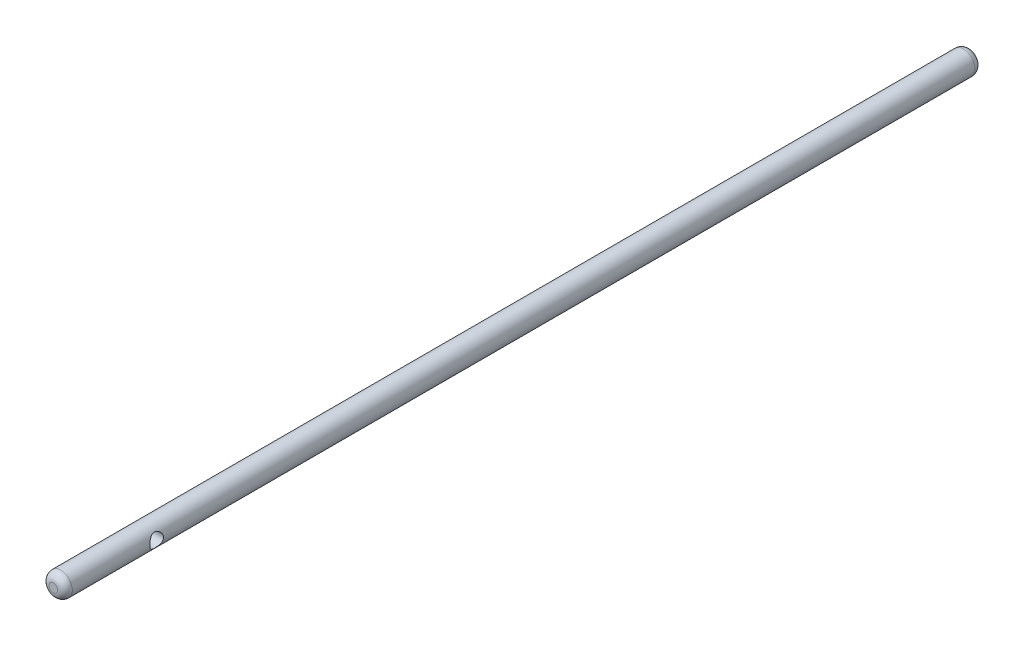
ISO-10303-21;
HEADER;
FILE_DESCRIPTION(('STEP AP214'),'2;1');
FILE_NAME('part.step','',(''),(''),'','','');
FILE_SCHEMA(('AUTOMOTIVE_DESIGN { 1 0 10303 214 1 1 1 1 }'));
ENDSEC;
DATA;
#1=APPLICATION_CONTEXT('core data for automotive mechanical design processes');
#2=APPLICATION_PROTOCOL_DEFINITION('international standard','automotive_design',2000,#1);
#3=PRODUCT_CONTEXT('',#1,'mechanical');
#4=PRODUCT('Part','Part','',(#3));
#5=PRODUCT_RELATED_PRODUCT_CATEGORY('part','',(#4));
#6=PRODUCT_DEFINITION_FORMATION('','',#4);
#7=PRODUCT_DEFINITION_CONTEXT('part definition',#1,'design');
#8=PRODUCT_DEFINITION('design','',#6,#7);
#9=PRODUCT_DEFINITION_SHAPE('','',#8);
#10=(LENGTH_UNIT() NAMED_UNIT(*) SI_UNIT(.MILLI.,.METRE.));
#11=(NAMED_UNIT(*) PLANE_ANGLE_UNIT() SI_UNIT($,.RADIAN.));
#12=(NAMED_UNIT(*) SI_UNIT($,.STERADIAN.) SOLID_ANGLE_UNIT());
#13=UNCERTAINTY_MEASURE_WITH_UNIT(LENGTH_MEASURE(1.E-05),#10,'distance_accuracy_value','');
#14=(GEOMETRIC_REPRESENTATION_CONTEXT(3) GLOBAL_UNCERTAINTY_ASSIGNED_CONTEXT((#13)) GLOBAL_UNIT_ASSIGNED_CONTEXT((#10,
#11,#12)) REPRESENTATION_CONTEXT('',''));
#15=CARTESIAN_POINT('',(0.,0.,0.));
#16=DIRECTION('',(0.,0.,1.));
#17=DIRECTION('',(1.,0.,0.));
#18=AXIS2_PLACEMENT_3D('',#15,#16,#17);
#19=CARTESIAN_POINT('',(0.,0.,-500.));
#20=DIRECTION('',(0.,0.,1.));
#21=DIRECTION('',(1.,0.,0.));
#22=AXIS2_PLACEMENT_3D('',#19,#20,#21);
#23=CYLINDRICAL_SURFACE('',#22,12.7);
#24=CARTESIAN_POINT('',(-12.6984250992003,0.199999999999999,407.5));
#25=CARTESIAN_POINT('',(-12.7014408806415,0.00843245733583666,407.499998475668));
#26=CARTESIAN_POINT('',(-12.7001142386903,-0.18326229050045,407.492648675079));
#27=CARTESIAN_POINT('',(-12.6888512329599,-0.565357987226296,407.46330905064));
#28=CARTESIAN_POINT('',(-12.6789095353173,-0.755758060923144,407.44131015901));
#29=CARTESIAN_POINT('',(-12.6506869813765,-1.13409392210284,407.382878791407));
#30=CARTESIAN_POINT('',(-12.6323896034887,-1.32202406483581,407.346417738429));
#31=CARTESIAN_POINT('',(-12.5879427007201,-1.69374092576526,407.25949029705));
#32=CARTESIAN_POINT('',(-12.5617898417468,-1.87752584893226,407.209017962549));
#33=CARTESIAN_POINT('',(-12.5024574274268,-2.23872362154391,407.094949727216));
#34=CARTESIAN_POINT('',(-12.4693150712888,-2.41616460762547,407.031423346212));
#35=CARTESIAN_POINT('',(-12.3966951095457,-2.7647173345326,406.891714114803));
#36=CARTESIAN_POINT('',(-12.3572150566043,-2.93582659879274,406.815526374744));
#37=CARTESIAN_POINT('',(-12.2728345273605,-3.27067463208774,406.651252806389));
#38=CARTESIAN_POINT('',(-12.2279381160267,-3.43441880345782,406.563175895068));
#39=CARTESIAN_POINT('',(-12.133643503418,-3.75399834042981,406.375754712707));
#40=CARTESIAN_POINT('',(-12.0842436420517,-3.90983075632296,406.276406283358));
#41=CARTESIAN_POINT('',(-11.9235310811938,-4.38593825731305,405.947654086718));
#42=CARTESIAN_POINT('',(-11.8058448920304,-4.6911315136987,405.69911392941));
#43=CARTESIAN_POINT('',(-11.5644700925307,-5.25815881251966,405.158703083844));
#44=CARTESIAN_POINT('',(-11.4407745884492,-5.51994146049535,404.866781800112));
#45=CARTESIAN_POINT('',(-11.2522374683788,-5.89062252097297,404.382025957762));
#46=CARTESIAN_POINT('',(-11.1855127038645,-6.01600785019944,404.202314542965));
#47=CARTESIAN_POINT('',(-11.0558167124279,-6.251154241863,403.831551558061));
#48=CARTESIAN_POINT('',(-10.9928460368361,-6.36091301263241,403.640498330462));
#49=CARTESIAN_POINT('',(-10.8729665563904,-6.56372391533479,403.248191733481));
#50=CARTESIAN_POINT('',(-10.8160509497455,-6.65679487538307,403.046950192208));
#51=CARTESIAN_POINT('',(-10.7104917980244,-6.82533987117187,402.635156362853));
#52=CARTESIAN_POINT('',(-10.6618456100311,-6.90081953198694,402.424607076748));
#53=CARTESIAN_POINT('',(-10.5845002165463,-7.01870227784268,402.042346598529));
#54=CARTESIAN_POINT('',(-10.5537640217388,-7.06472889802692,401.872157513883));
#55=CARTESIAN_POINT('',(-10.499685472649,-7.14485464262336,401.527852600083));
#56=CARTESIAN_POINT('',(-10.476341629625,-7.17895616876805,401.353737569149));
#57=CARTESIAN_POINT('',(-10.4378700783978,-7.23477855282613,401.002798793531));
#58=CARTESIAN_POINT('',(-10.4227346361699,-7.25651106588678,400.825977760585));
#59=CARTESIAN_POINT('',(-10.4012046251758,-7.28733827499528,400.470697556117));
#60=CARTESIAN_POINT('',(-10.3948102042321,-7.29643275731717,400.292238356943));
#61=CARTESIAN_POINT('',(-10.3910055963949,-7.30185006995639,399.934724909439));
#62=CARTESIAN_POINT('',(-10.3936107272691,-7.29815112509373,399.755670165309));
#63=CARTESIAN_POINT('',(-10.4077379283561,-7.27799013783562,399.398639068029));
#64=CARTESIAN_POINT('',(-10.4192600382618,-7.26152803862632,399.220662719682));
#65=CARTESIAN_POINT('',(-10.4507915107074,-7.21607357006515,398.867016601017));
#66=CARTESIAN_POINT('',(-10.4708042377926,-7.18707623333507,398.691347773571));
#67=CARTESIAN_POINT('',(-10.5186096451898,-7.11692687276256,398.343472187031));
#68=CARTESIAN_POINT('',(-10.5464054799055,-7.07576992039479,398.171266862048));
#69=CARTESIAN_POINT('',(-10.6085230470658,-6.98228824898791,397.833165907502));
#70=CARTESIAN_POINT('',(-10.6427720998919,-6.93008717901108,397.667222601945));
#71=CARTESIAN_POINT('',(-10.7169814153346,-6.81476384851618,397.340464364831));
#72=CARTESIAN_POINT('',(-10.756943547512,-6.75163801152342,397.179651133205));
#73=CARTESIAN_POINT('',(-10.8838031984132,-6.54665324427669,396.705910588698));
#74=CARTESIAN_POINT('',(-10.9777065650814,-6.38914011402646,396.401514901478));
#75=CARTESIAN_POINT('',(-11.1916958010933,-6.0075774324514,395.772436107813));
#76=CARTESIAN_POINT('',(-11.3135630262078,-5.77689857912188,395.452376161977));
#77=CARTESIAN_POINT('',(-11.4975357044339,-5.39598799077041,395.002640301117));
#78=CARTESIAN_POINT('',(-11.5591019039025,-5.26308948805013,394.857689954567));
#79=CARTESIAN_POINT('',(-11.6812785861729,-4.98604289804121,394.578410224891));
#80=CARTESIAN_POINT('',(-11.7418889025849,-4.8418928776305,394.444082674882));
#81=CARTESIAN_POINT('',(-11.8678013255451,-4.52522457456646,394.171543778134));
#82=CARTESIAN_POINT('',(-11.9328112588691,-4.35136708321929,394.03474991998));
#83=CARTESIAN_POINT('',(-12.0580652490799,-3.99116516979889,393.776397393245));
#84=CARTESIAN_POINT('',(-12.1183112407378,-3.80482587432357,393.654832527897));
#85=CARTESIAN_POINT('',(-12.2323137029125,-3.42061977713192,393.428024652177));
#86=CARTESIAN_POINT('',(-12.286071633771,-3.2227555843764,393.322777967363));
#87=CARTESIAN_POINT('',(-12.3854659196524,-2.81671746843187,393.129779956478));
#88=CARTESIAN_POINT('',(-12.4311033180087,-2.60854487407533,393.042026382702));
#89=CARTESIAN_POINT('',(-12.5098843682192,-2.19846729485912,392.890732244151));
#90=CARTESIAN_POINT('',(-12.5436826802771,-1.99715771039033,392.82591948993));
#91=CARTESIAN_POINT('',(-12.60195327381,-1.58850714648028,392.713289534136));
#92=CARTESIAN_POINT('',(-12.6264259033909,-1.38116639247954,392.665471698186));
#93=CARTESIAN_POINT('',(-12.6652246673758,-0.96242304263274,392.587572105872));
#94=CARTESIAN_POINT('',(-12.6795595326386,-0.751024103366659,392.55747509171));
#95=CARTESIAN_POINT('',(-12.6975964690562,-0.325987164099469,392.515420777907));
#96=CARTESIAN_POINT('',(-12.7012997861027,-0.112349429403914,392.503461352832));
#97=CARTESIAN_POINT('',(-12.6981052703946,0.288230428514965,392.498189249279));
#98=CARTESIAN_POINT('',(-12.6924792523771,0.475158842161556,392.502725255581));
#99=CARTESIAN_POINT('',(-12.6730477100264,0.84773265751428,392.52569262094));
#100=CARTESIAN_POINT('',(-12.6592423303762,1.03337808185617,392.544123734211));
#101=CARTESIAN_POINT('',(-12.6237324144718,1.40202497684361,392.59461338564));
#102=CARTESIAN_POINT('',(-12.6020281842127,1.58502654962432,392.626671395911));
#103=CARTESIAN_POINT('',(-12.551175709663,1.94715887496309,392.703992747738));
#104=CARTESIAN_POINT('',(-12.5220272312363,2.12628950558028,392.749256504647));
#105=CARTESIAN_POINT('',(-12.4572314694887,2.47769123223032,392.851905001765));
#106=CARTESIAN_POINT('',(-12.4216570268015,2.6500152022577,392.9091549273));
#107=CARTESIAN_POINT('',(-12.3444994829221,2.98891127097746,393.035467118587));
#108=CARTESIAN_POINT('',(-12.3029144012085,3.15548145127887,393.104533279204));
#109=CARTESIAN_POINT('',(-12.1702943635033,3.64527963738889,393.328511153114));
#110=CARTESIAN_POINT('',(-12.0713469802098,3.95884469753889,393.500276111835));
#111=CARTESIAN_POINT('',(-11.8475847824787,4.58784873017469,393.904765744695));
#112=CARTESIAN_POINT('',(-11.7211209995711,4.89968628536997,394.142122250626));
#113=CARTESIAN_POINT('',(-11.460545148463,5.48156385528155,394.660795732797));
#114=CARTESIAN_POINT('',(-11.3264236352952,5.75155065830454,394.942167775066));
#115=CARTESIAN_POINT('',(-11.1196685839662,6.13742386202432,395.412507417316));
#116=CARTESIAN_POINT('',(-11.045753680156,6.26912852100599,395.588189016651));
#117=CARTESIAN_POINT('',(-10.901200349098,6.51723956493896,395.951439500261));
#118=CARTESIAN_POINT('',(-10.8305624730036,6.63364338248019,396.139010371693));
#119=CARTESIAN_POINT('',(-10.6949835146619,6.85008273147863,396.525043131302));
#120=CARTESIAN_POINT('',(-10.6300363657176,6.95013579488697,396.723493045424));
#121=CARTESIAN_POINT('',(-10.5082284772461,7.13296611598895,397.130555268636));
#122=CARTESIAN_POINT('',(-10.4513648348716,7.21574958034169,397.339163893345));
#123=CARTESIAN_POINT('',(-10.3603481688753,7.34560496278158,397.715248965298));
#124=CARTESIAN_POINT('',(-10.3239976363185,7.39649801930598,397.880882542627));
#125=CARTESIAN_POINT('',(-10.2586000708784,7.48693813041222,398.216544290421));
#126=CARTESIAN_POINT('',(-10.229548517189,7.52649221022586,398.38656966838));
#127=CARTESIAN_POINT('',(-10.1797153568396,7.59375739456248,398.729985932409));
#128=CARTESIAN_POINT('',(-10.1589261073829,7.62147944571194,398.903373551863));
#129=CARTESIAN_POINT('',(-10.12633417824,7.66473052125041,399.252513431133));
#130=CARTESIAN_POINT('',(-10.1145315933228,7.68025941705646,399.428265715867));
#131=CARTESIAN_POINT('',(-10.1003472366476,7.69890421132233,399.781381637833));
#132=CARTESIAN_POINT('',(-10.0979959747138,7.70197990983658,399.958748643994));
#133=CARTESIAN_POINT('',(-10.1028922217025,7.69555612971411,400.31312033619));
#134=CARTESIAN_POINT('',(-10.1101397579513,7.68605661527755,400.490125021193));
#135=CARTESIAN_POINT('',(-10.1339531719106,7.6546311607996,400.842484745533));
#136=CARTESIAN_POINT('',(-10.1505241727639,7.63269838876759,401.017838823973));
#137=CARTESIAN_POINT('',(-10.1923603016095,7.57674115608867,401.365541206039));
#138=CARTESIAN_POINT('',(-10.217625528874,7.54271655737498,401.53788947532));
#139=CARTESIAN_POINT('',(-10.2748848629583,7.4645157547344,401.87221401799));
#140=CARTESIAN_POINT('',(-10.3065956467105,7.42076139571833,402.034338175023));
#141=CARTESIAN_POINT('',(-10.3763262009409,7.32294044079929,402.35408040555));
#142=CARTESIAN_POINT('',(-10.4143481065943,7.26887035395724,402.511696932797));
#143=CARTESIAN_POINT('',(-10.5363645016003,7.09193719819432,402.976771586098));
#144=CARTESIAN_POINT('',(-10.6283403024419,6.95431115569881,403.276623320934));
#145=CARTESIAN_POINT('',(-10.8415901177579,6.61782731652623,403.899564265047));
#146=CARTESIAN_POINT('',(-10.9651955306718,6.41263433728091,404.218423947271));
#147=CARTESIAN_POINT('',(-11.1551857534009,6.07197253507479,404.669638524751));
#148=CARTESIAN_POINT('',(-11.2193258384075,5.95284531842358,404.815623221899));
#149=CARTESIAN_POINT('',(-11.3478780489717,5.70396851292122,405.098212683704));
#150=CARTESIAN_POINT('',(-11.4122902167997,5.57421721128974,405.234815929362));
#151=CARTESIAN_POINT('',(-11.550551591037,5.28250838448752,405.519617531724));
#152=CARTESIAN_POINT('',(-11.6242234353978,5.11875231183112,405.666064428153));
#153=CARTESIAN_POINT('',(-11.7683011589476,4.77820646892204,405.944610570529));
#154=CARTESIAN_POINT('',(-11.8387080434993,4.60142075482622,406.076714250146));
#155=CARTESIAN_POINT('',(-11.9745340285013,4.23540571361715,406.325703222225));
#156=CARTESIAN_POINT('',(-12.0399494802987,4.04616746857862,406.442577425539));
#157=CARTESIAN_POINT('',(-12.1640023393268,3.65634616771156,406.65983817601));
#158=CARTESIAN_POINT('',(-12.2226406471301,3.45576462451134,406.760226914566));
#159=CARTESIAN_POINT('',(-12.3296827650451,3.05142114911469,406.940223436029));
#160=CARTESIAN_POINT('',(-12.3783651394558,2.84799487734815,407.020418099287));
#161=CARTESIAN_POINT('',(-12.4665466710924,2.43313730595081,407.16318329873));
#162=CARTESIAN_POINT('',(-12.5060476122465,2.2217075706708,407.22575725907));
#163=CARTESIAN_POINT('',(-12.5746212616385,1.79327054770449,407.332124924544));
#164=CARTESIAN_POINT('',(-12.6037275873961,1.57628371806674,407.375979262866));
#165=CARTESIAN_POINT('',(-12.6508056052939,1.13822421950596,407.444380149631));
#166=CARTESIAN_POINT('',(-12.6687870657606,0.917155311088124,407.468943641763));
#167=CARTESIAN_POINT('',(-12.685473261577,0.612858556935036,407.489083778783));
#168=CARTESIAN_POINT('',(-12.6891890939816,0.530382538923153,407.493174963271));
#169=CARTESIAN_POINT('',(-12.6950144697944,0.365278910865009,407.498633457567));
#170=CARTESIAN_POINT('',(-12.6971239485063,0.282651294847429,407.500000657669));
#171=CARTESIAN_POINT('',(-12.6984250992003,0.199999999999999,407.5));
#172=B_SPLINE_CURVE_WITH_KNOTS('',3,(#24,#25,#26,#27,#28,#29,#30,#31,#32,#33,#34,#35,#36,#37,
#38,#39,#40,#41,#42,#43,#44,#45,#46,#47,#48,#49,#50,#51,#52,#53,#54,#55,#56,#57,#58,#59,#60,#61,
#62,#63,#64,#65,#66,#67,#68,#69,#70,#71,#72,#73,#74,#75,#76,#77,#78,#79,#80,#81,#82,#83,#84,#85,
#86,#87,#88,#89,#90,#91,#92,#93,#94,#95,#96,#97,#98,#99,#100,#101,#102,#103,#104,#105,#106,#107,
#108,#109,#110,#111,#112,#113,#114,#115,#116,#117,#118,#119,#120,#121,#122,#123,#124,#125,#126,
#127,#128,#129,#130,#131,#132,#133,#134,#135,#136,#137,#138,#139,#140,#141,#142,#143,#144,#145,
#146,#147,#148,#149,#150,#151,#152,#153,#154,#155,#156,#157,#158,#159,#160,#161,#162,#163,#164,
#165,#166,#167,#168,#169,#170,#171),.UNSPECIFIED.,.T.,.F.,(4,2,2,2,2,2,2,2,2,2,2,2,2,2,2,2,2,2,
2,2,2,2,2,2,2,2,2,2,2,2,2,2,2,2,2,2,2,2,2,2,2,2,2,2,2,2,2,2,2,2,2,2,2,2,2,2,2,2,2,2,2,2,2,2,2,2,
2,2,2,2,2,2,2,4),(0.,0.574686382978431,1.14972882755658,1.7259132532644,2.30234257464781,
2.8757781586545,3.44943571298682,4.02266538563464,4.59610722707754,5.82335287275643,
7.0520412567176,7.73851175215962,8.42508281647378,9.11087431081996,9.7964462115328,
10.3327880929991,10.8690218920797,11.404749565453,11.9404862985861,12.4771353361697,
13.0137867626039,13.5506510448199,14.0877332276488,14.6190935132804,15.1506280821668,
16.2131714246274,17.4467732335075,18.0645024489846,18.6823380310603,19.3731980307551,
20.063775996048,20.7541982340618,21.4445317018452,22.0861190765145,22.7276824998762,
23.368692720055,24.0096278183472,24.5701455348219,25.1306533367151,25.6911394273031,
26.251643148437,26.8061521387066,27.3608442594415,28.4694435489744,29.7002100811463,
30.9325288739445,31.6268593673634,32.321306217892,33.015003497755,33.7084510330521,
34.2390783713296,34.7693762374812,35.2991824193619,35.8289941882403,36.3605148760859,
36.892037077098,37.4238516294546,37.9556722543663,38.4678299638141,38.9801613006562,
40.0043013904108,41.1960681690413,41.7927843204264,42.3895968625747,43.0839078904948,
43.7780036833889,44.4726020822962,45.1671080739525,45.8381808283642,46.5091230859194,
47.1778753484696,47.8460395682734,48.0939764587493,48.3419233344245),.UNSPECIFIED.);
#173=CARTESIAN_POINT('',(-12.6984250992003,0.199999999999999,407.5));
#174=VERTEX_POINT('',#173);
#175=EDGE_CURVE('E66',#174,#174,#172,.T.);
#176=ORIENTED_EDGE('',*,*,#175,.T.);
#177=EDGE_LOOP('',(#176));
#178=FACE_BOUND('',#177,.T.);
#179=CARTESIAN_POINT('',(0.,0.,492.));
#180=DIRECTION('',(0.,0.,1.));
#181=DIRECTION('',(1.,0.,0.));
#182=AXIS2_PLACEMENT_3D('',#179,#180,#181);
#183=CIRCLE('',#182,12.7);
#184=CARTESIAN_POINT('',(12.7,0.,492.));
#185=VERTEX_POINT('',#184);
#186=EDGE_CURVE('E57',#185,#185,#183,.F.);
#187=ORIENTED_EDGE('',*,*,#186,.T.);
#188=EDGE_LOOP('',(#187));
#189=FACE_BOUND('',#188,.T.);
#190=CARTESIAN_POINT('',(0.,0.,-492.));
#191=DIRECTION('',(0.,0.,1.));
#192=DIRECTION('',(1.,0.,0.));
#193=AXIS2_PLACEMENT_3D('',#190,#191,#192);
#194=CIRCLE('',#193,12.7);
#195=CARTESIAN_POINT('',(12.7,0.,-492.));
#196=VERTEX_POINT('',#195);
#197=EDGE_CURVE('E63',#196,#196,#194,.T.);
#198=ORIENTED_EDGE('',*,*,#197,.T.);
#199=EDGE_LOOP('',(#198));
#200=FACE_BOUND('',#199,.T.);
#201=CARTESIAN_POINT('',(12.7,0.,392.502667140909));
#202=CARTESIAN_POINT('',(12.6999986847348,-0.193025942323715,392.507817768516));
#203=CARTESIAN_POINT('',(12.6955875450334,-0.385923788571479,392.520434394221));
#204=CARTESIAN_POINT('',(12.6781024036615,-0.769869635047159,392.560466877365));
#205=CARTESIAN_POINT('',(12.6650225338014,-0.960916293188612,392.587892757415));
#206=CARTESIAN_POINT('',(12.6305436790129,-1.34002484372148,392.657280333348));
#207=CARTESIAN_POINT('',(12.6091265897869,-1.52807930716432,392.699273640691));
#208=CARTESIAN_POINT('',(12.5585451588545,-1.89949983430184,392.797290975507));
#209=CARTESIAN_POINT('',(12.5293774656977,-2.08286383209282,392.853321072049));
#210=CARTESIAN_POINT('',(12.4642161504236,-2.44265042841487,392.978428841674));
#211=CARTESIAN_POINT('',(12.4282615831639,-2.61910609034377,393.04743185382));
#212=CARTESIAN_POINT('',(12.3502667377602,-2.96520535285584,393.198004664004));
#213=CARTESIAN_POINT('',(12.308224113874,-3.13484629538112,393.279579306703));
#214=CARTESIAN_POINT('',(12.1744025812127,-3.63198898883473,393.541979989704));
#215=CARTESIAN_POINT('',(12.07483865959,-3.94819347227574,393.740652698839));
#216=CARTESIAN_POINT('',(11.8550316376155,-4.56778778571722,394.196754962762));
#217=CARTESIAN_POINT('',(11.7337882441037,-4.86833540020801,394.457521999101));
#218=CARTESIAN_POINT('',(11.4873371551811,-5.42434816802414,395.022662509066));
#219=CARTESIAN_POINT('',(11.3621246872462,-5.67975641616603,395.327090160606));
#220=CARTESIAN_POINT('',(11.1739499886766,-6.03769316484867,395.829907923343));
#221=CARTESIAN_POINT('',(11.1081160208779,-6.15762381831198,396.015085121099));
#222=CARTESIAN_POINT('',(10.9811121311353,-6.38135539225304,396.396580609803));
#223=CARTESIAN_POINT('',(10.9199428771643,-6.48515400487291,396.592900489354));
#224=CARTESIAN_POINT('',(10.8046650637759,-6.67544665719826,396.995382910879));
#225=CARTESIAN_POINT('',(10.7505464892629,-6.76196533735361,397.201530910821));
#226=CARTESIAN_POINT('',(10.6515955072427,-6.9167889172993,397.622691015373));
#227=CARTESIAN_POINT('',(10.6067598340062,-6.98510022489091,397.837699970667));
#228=CARTESIAN_POINT('',(10.5375228544779,-7.08897434792857,398.224807681837));
#229=CARTESIAN_POINT('',(10.5107933238225,-7.1284544984521,398.395448248565));
#230=CARTESIAN_POINT('',(10.4650137298829,-7.19549462392251,398.740058384663));
#231=CARTESIAN_POINT('',(10.4459621431131,-7.22305696372414,398.91402728643));
#232=CARTESIAN_POINT('',(10.4162187462821,-7.26588394074574,399.264040013284));
#233=CARTESIAN_POINT('',(10.4055200485529,-7.28115871042942,399.440082007069));
#234=CARTESIAN_POINT('',(10.3928519484168,-7.29922956585351,399.793127870596));
#235=CARTESIAN_POINT('',(10.3908827614686,-7.30202534359195,399.970131763972));
#236=CARTESIAN_POINT('',(10.3957508178734,-7.29509301714213,400.323876545864));
#237=CARTESIAN_POINT('',(10.4025933148917,-7.28535744156473,400.500617214522));
#238=CARTESIAN_POINT('',(10.4248359779778,-7.25349358105998,400.852427545964));
#239=CARTESIAN_POINT('',(10.4402361815226,-7.23136524186067,401.027497201426));
#240=CARTESIAN_POINT('',(10.4790457969306,-7.17500978803173,401.374847170916));
#241=CARTESIAN_POINT('',(10.502458801764,-7.14077724560293,401.547126197256));
#242=CARTESIAN_POINT('',(10.5565096778809,-7.06062573366281,401.887845570778));
#243=CARTESIAN_POINT('',(10.5871504706738,-7.01470203793013,402.056284335435));
#244=CARTESIAN_POINT('',(10.6551087909723,-6.91104468875676,402.390398143277));
#245=CARTESIAN_POINT('',(10.6925020332941,-6.85317591752883,402.556015759435));
#246=CARTESIAN_POINT('',(10.7726441161716,-6.72649641956064,402.881700798021));
#247=CARTESIAN_POINT('',(10.8153947191791,-6.657682089961,403.041766371724));
#248=CARTESIAN_POINT('',(10.9500178065219,-6.43561046102193,403.512707728938));
#249=CARTESIAN_POINT('',(11.0482943668191,-6.26667657732906,403.814480830893));
#250=CARTESIAN_POINT('',(11.2706796293701,-5.85869595899607,404.438909428962));
#251=CARTESIAN_POINT('',(11.3963430569905,-5.6126180729875,404.756431075158));
#252=CARTESIAN_POINT('',(11.5840005172239,-5.20799253453269,405.200365431821));
#253=CARTESIAN_POINT('',(11.646460132097,-5.0670796536427,405.343047475094));
#254=CARTESIAN_POINT('',(11.7697029203033,-4.77382009653787,405.617060749792));
#255=CARTESIAN_POINT('',(11.830485812319,-4.62147151742587,405.748390084271));
#256=CARTESIAN_POINT('',(11.9547887604733,-4.29037401881345,406.011283758835));
#257=CARTESIAN_POINT('',(12.0179865914564,-4.11050361964705,406.14159121656));
#258=CARTESIAN_POINT('',(12.1388056204949,-3.73866130695203,406.386428500535));
#259=CARTESIAN_POINT('',(12.1964292568815,-3.54669474591303,406.500965234772));
#260=CARTESIAN_POINT('',(12.3044005579471,-3.15176316649335,406.713114199508));
#261=CARTESIAN_POINT('',(12.3547512307992,-2.94880274332529,406.810733430617));
#262=CARTESIAN_POINT('',(12.4466094181048,-2.53321421859135,406.987885212786));
#263=CARTESIAN_POINT('',(12.4881182447426,-2.32058755724591,407.067420447741));
#264=CARTESIAN_POINT('',(12.5577030925572,-1.90637369639949,407.201133286089));
#265=CARTESIAN_POINT('',(12.5866370876544,-1.70545018838757,407.256921492333));
#266=CARTESIAN_POINT('',(12.6350976039532,-1.29856365111903,407.351729704195));
#267=CARTESIAN_POINT('',(12.6546246200004,-1.09260088754691,407.390750591831));
#268=CARTESIAN_POINT('',(12.6836161286261,-0.677584375840627,407.451429031121));
#269=CARTESIAN_POINT('',(12.6930880527439,-0.468533026454645,407.473099403315));
#270=CARTESIAN_POINT('',(12.701636008806,-0.0491443255277767,407.498803223939));
#271=CARTESIAN_POINT('',(12.7007130428043,0.161192900102586,407.502838372329));
#272=CARTESIAN_POINT('',(12.6891645458072,0.556252876643384,407.49382267625));
#273=CARTESIAN_POINT('',(12.6797012113454,0.741058599535266,407.482739017316));
#274=CARTESIAN_POINT('',(12.6528491600942,1.10877698197418,407.447029125112));
#275=CARTESIAN_POINT('',(12.6354604623185,1.29168964606176,407.422402924334));
#276=CARTESIAN_POINT('',(12.5931123742666,1.65434372713416,407.359941749877));
#277=CARTESIAN_POINT('',(12.5681530660938,1.83408517848847,407.322106919447));
#278=CARTESIAN_POINT('',(12.5111752359398,2.18925819730479,407.233695455608));
#279=CARTESIAN_POINT('',(12.4791564321095,2.36468959237763,407.183118313454));
#280=CARTESIAN_POINT('',(12.4084830200157,2.71127371513387,407.069438237834));
#281=CARTESIAN_POINT('',(12.3697899097121,2.88239461864312,407.006262275646));
#282=CARTESIAN_POINT('',(12.2866504006495,3.21842100350646,406.868199921736));
#283=CARTESIAN_POINT('',(12.2422020838714,3.38332438900522,406.793309624276));
#284=CARTESIAN_POINT('',(12.1014485145916,3.86751240510708,406.552040331296));
#285=CARTESIAN_POINT('',(11.997685599866,4.17650725180554,406.368985761114));
#286=CARTESIAN_POINT('',(11.7644420834955,4.79693769756796,405.939462202425));
#287=CARTESIAN_POINT('',(11.6333708380187,5.10431316490686,405.688046172715));
#288=CARTESIAN_POINT('',(11.3658454548753,5.67511398913581,405.140965416135));
#289=CARTESIAN_POINT('',(11.2293841754467,5.93847843969231,404.84524042591));
#290=CARTESIAN_POINT('',(11.0220034051313,6.3110162324096,404.353666377095));
#291=CARTESIAN_POINT('',(10.9487182693246,6.43696967158876,404.171282451422));
#292=CARTESIAN_POINT('',(10.8065055965144,6.67295918177926,403.794752229274));
#293=CARTESIAN_POINT('',(10.7375787984291,6.78299255773436,403.600603949122));
#294=CARTESIAN_POINT('',(10.6066561191655,6.98594479275474,403.201712876621));
#295=CARTESIAN_POINT('',(10.5446500515307,7.07888893915216,402.996986321749));
#296=CARTESIAN_POINT('',(10.4300299569182,7.24671047369917,402.577749639024));
#297=CARTESIAN_POINT('',(10.3774121695412,7.32159509968819,402.363243471735));
#298=CARTESIAN_POINT('',(10.295879902558,7.43562032182633,401.981140125257));
#299=CARTESIAN_POINT('',(10.2643344633914,7.47901234525557,401.81536192627));
#300=CARTESIAN_POINT('',(10.2088842621685,7.55452732530178,401.480016157951));
#301=CARTESIAN_POINT('',(10.1849777652151,7.586652840842,401.310449458407));
#302=CARTESIAN_POINT('',(10.1456367874525,7.6391841444556,400.968707780136));
#303=CARTESIAN_POINT('',(10.1301937547867,7.65960176367223,400.796535615581));
#304=CARTESIAN_POINT('',(10.1083072030871,7.68846257648385,400.45061011867));
#305=CARTESIAN_POINT('',(10.1018638592437,7.6969055369771,400.2768567556));
#306=CARTESIAN_POINT('',(10.0982205591572,7.70168496644778,399.928771568734));
#307=CARTESIAN_POINT('',(10.1010373024086,7.69799956331398,399.75443926688));
#308=CARTESIAN_POINT('',(10.1158420899226,7.678534104791,399.406847857247));
#309=CARTESIAN_POINT('',(10.1278301781084,7.66275399147817,399.233588754613));
#310=CARTESIAN_POINT('',(10.1605354684884,7.61933419652779,398.889325425827));
#311=CARTESIAN_POINT('',(10.1812567320367,7.59168899693447,398.718322287017));
#312=CARTESIAN_POINT('',(10.2307061413409,7.52491682799924,398.37969339126));
#313=CARTESIAN_POINT('',(10.2594375601123,7.48578516484716,398.212069045003));
#314=CARTESIAN_POINT('',(10.3236556139581,7.39696578354648,397.882815359723));
#315=CARTESIAN_POINT('',(10.3590727025117,7.34738617962861,397.721143152438));
#316=CARTESIAN_POINT('',(10.4358363449694,7.23794061505651,397.402741207081));
#317=CARTESIAN_POINT('',(10.4771848393174,7.178071286871,397.24601310701));
#318=CARTESIAN_POINT('',(10.6085362475142,6.98379579281059,396.784158301563));
#319=CARTESIAN_POINT('',(10.7058775476145,6.83467902002015,396.487203661345));
#320=CARTESIAN_POINT('',(10.9303512393864,6.47076291514006,395.867333883955));
#321=CARTESIAN_POINT('',(11.0596951913979,6.24897913687993,395.549320204144));
#322=CARTESIAN_POINT('',(11.2563396759631,5.88253086757624,395.101415754043));
#323=CARTESIAN_POINT('',(11.3223748090791,5.75464758122999,394.956872648421));
#324=CARTESIAN_POINT('',(11.454010380564,5.48796233302197,394.677906165141));
#325=CARTESIAN_POINT('',(11.5196107431774,5.34915851989358,394.54348451088));
#326=CARTESIAN_POINT('',(11.6583751167838,5.04033093288363,394.266748728667));
#327=CARTESIAN_POINT('',(11.7312646884403,4.86869229041109,394.126094468132));
#328=CARTESIAN_POINT('',(11.8728090001213,4.51254991481215,393.859860065731));
#329=CARTESIAN_POINT('',(11.9414652105735,4.32805069669616,393.734274675298));
#330=CARTESIAN_POINT('',(12.0728026323722,3.94690791181646,393.499166394373));
#331=CARTESIAN_POINT('',(12.1354807561731,3.75025815504744,393.389651788516));
#332=CARTESIAN_POINT('',(12.2530926973697,3.34604263537571,393.187995372637));
#333=CARTESIAN_POINT('',(12.3080277996538,3.13847869145708,393.095850679367));
#334=CARTESIAN_POINT('',(12.405640911754,2.72622416715215,392.934997646101));
#335=CARTESIAN_POINT('',(12.4488462180124,2.52206946960781,392.865237400438));
#336=CARTESIAN_POINT('',(12.525799037357,2.10687148702319,392.743235286794));
#337=CARTESIAN_POINT('',(12.5595483937117,1.89582955349417,392.690990004191));
#338=CARTESIAN_POINT('',(12.6165439816894,1.46934104068336,392.605004970647));
#339=CARTESIAN_POINT('',(12.63982384135,1.25391092106494,392.571205894667));
#340=CARTESIAN_POINT('',(12.6753549095567,0.82014908915251,392.522502709203));
#341=CARTESIAN_POINT('',(12.6876158825915,0.601820120181769,392.507581865806));
#342=CARTESIAN_POINT('',(12.6961453923798,0.319355335683714,392.500677168671));
#343=CARTESIAN_POINT('',(12.6975906054313,0.255489431564887,392.499933228778));
#344=CARTESIAN_POINT('',(12.6995181251557,0.127744344023758,392.500076141434));
#345=CARTESIAN_POINT('',(12.7000004351727,0.0638651606483444,392.500962988319));
#346=CARTESIAN_POINT('',(12.7,0.,392.502667140909));
#347=B_SPLINE_CURVE_WITH_KNOTS('',3,(#201,#202,#203,#204,#205,#206,#207,#208,#209,#210,#211,
#212,#213,#214,#215,#216,#217,#218,#219,#220,#221,#222,#223,#224,#225,#226,#227,#228,#229,#230,
#231,#232,#233,#234,#235,#236,#237,#238,#239,#240,#241,#242,#243,#244,#245,#246,#247,#248,#249,
#250,#251,#252,#253,#254,#255,#256,#257,#258,#259,#260,#261,#262,#263,#264,#265,#266,#267,#268,
#269,#270,#271,#272,#273,#274,#275,#276,#277,#278,#279,#280,#281,#282,#283,#284,#285,#286,#287,
#288,#289,#290,#291,#292,#293,#294,#295,#296,#297,#298,#299,#300,#301,#302,#303,#304,#305,#306,
#307,#308,#309,#310,#311,#312,#313,#314,#315,#316,#317,#318,#319,#320,#321,#322,#323,#324,#325,
#326,#327,#328,#329,#330,#331,#332,#333,#334,#335,#336,#337,#338,#339,#340,#341,#342,#343,#344,
#345,#346),.UNSPECIFIED.,.T.,.F.,(4,2,2,2,2,2,2,2,2,2,2,2,2,2,2,2,2,2,2,2,2,2,2,2,2,2,2,2,2,2,2,
2,2,2,2,2,2,2,2,2,2,2,2,2,2,2,2,2,2,2,2,2,2,2,2,2,2,2,2,2,2,2,2,2,2,2,2,2,2,2,2,2,4),(0.,
0.579214571304071,1.15882163577963,1.73969440351152,2.32081875721536,2.89869572435744,
3.4767959442115,4.63145387564381,5.87465778884122,7.11941794468321,7.80939036716346,
8.49946140676599,9.18854129636367,9.87737835384946,10.4083560081331,10.9392282519564,
11.4696622827281,12.0001094054087,12.5308729355126,13.061638790021,13.592642954447,
14.1238621224249,14.6614564813633,15.1992281634111,16.2742861867572,17.5316114196248,
18.1612234752511,18.7909405314031,19.4828280073931,20.1744114479232,20.8657080182215,
21.5569019242675,22.1875709197932,22.8182067359254,23.4483761351654,24.0784847874011,
24.6339584590503,25.1894307980721,25.7448971132005,26.3003856092448,26.8591928114919,
27.4181867272742,28.5354332300828,29.7852371276094,31.0367565424362,31.7363751255052,
32.4361120065225,33.1348049879,33.8332174821489,34.3554243120201,34.8775124579166,
35.3990720857489,35.9206418662532,36.4431527530386,36.9656661422341,37.4884227943254,
38.0113933629562,38.5291969549705,39.0471703330469,40.0826226052503,41.3038539719888,
41.9153578492404,42.5269656139799,43.2268235857363,43.9264370813365,44.6264099766104,
45.3262665802489,45.9853900926553,46.6443850311681,47.3012478888642,47.9575280858343,
48.149169476987,48.3408102025852),.UNSPECIFIED.);
#348=CARTESIAN_POINT('',(12.7,0.,392.502667140909));
#349=VERTEX_POINT('',#348);
#350=EDGE_CURVE('E47',#349,#349,#347,.T.);
#351=ORIENTED_EDGE('',*,*,#350,.T.);
#352=EDGE_LOOP('',(#351));
#353=FACE_BOUND('',#352,.T.);
#354=ADVANCED_FACE('F43',(#178,#189,#200,#353),#23,.T.);
#355=CARTESIAN_POINT('',(0.,0.,-500.));
#356=DIRECTION('',(0.,0.,1.));
#357=DIRECTION('',(1.,0.,0.));
#358=AXIS2_PLACEMENT_3D('',#355,#356,#357);
#359=PLANE('',#358);
#360=CARTESIAN_POINT('',(0.,0.,-500.));
#361=DIRECTION('',(0.,0.,1.));
#362=DIRECTION('',(1.,0.,0.));
#363=AXIS2_PLACEMENT_3D('',#360,#361,#362);
#364=CIRCLE('',#363,4.7);
#365=CARTESIAN_POINT('',(4.7,0.,-500.));
#366=VERTEX_POINT('',#365);
#367=EDGE_CURVE('E10',#366,#366,#364,.F.);
#368=ORIENTED_EDGE('',*,*,#367,.T.);
#369=EDGE_LOOP('',(#368));
#370=FACE_BOUND('',#369,.T.);
#371=ADVANCED_FACE('F83',(#370),#359,.F.);
#372=CARTESIAN_POINT('',(0.,0.,500.));
#373=DIRECTION('',(0.,0.,1.));
#374=DIRECTION('',(1.,0.,0.));
#375=AXIS2_PLACEMENT_3D('',#372,#373,#374);
#376=PLANE('',#375);
#377=CARTESIAN_POINT('',(0.,0.,500.));
#378=DIRECTION('',(0.,0.,1.));
#379=DIRECTION('',(1.,0.,0.));
#380=AXIS2_PLACEMENT_3D('',#377,#378,#379);
#381=CIRCLE('',#380,4.7);
#382=CARTESIAN_POINT('',(4.7,0.,500.));
#383=VERTEX_POINT('',#382);
#384=EDGE_CURVE('E103',#383,#383,#381,.T.);
#385=ORIENTED_EDGE('',*,*,#384,.T.);
#386=EDGE_LOOP('',(#385));
#387=FACE_BOUND('',#386,.T.);
#388=ADVANCED_FACE('F79',(#387),#376,.T.);
#389=CARTESIAN_POINT('',(0.,0.,492.));
#390=DIRECTION('',(0.,0.,1.));
#391=DIRECTION('',(1.,0.,0.));
#392=AXIS2_PLACEMENT_3D('',#389,#390,#391);
#393=DEGENERATE_TOROIDAL_SURFACE('',#392,4.7,8.,.T.);
#394=ORIENTED_EDGE('',*,*,#186,.F.);
#395=EDGE_LOOP('',(#394));
#396=FACE_BOUND('',#395,.T.);
#397=ORIENTED_EDGE('',*,*,#384,.F.);
#398=EDGE_LOOP('',(#397));
#399=FACE_BOUND('',#398,.T.);
#400=ADVANCED_FACE('F82',(#396,#399),#393,.T.);
#401=CARTESIAN_POINT('',(0.,0.,-492.));
#402=DIRECTION('',(0.,0.,1.));
#403=DIRECTION('',(1.,0.,0.));
#404=AXIS2_PLACEMENT_3D('',#401,#402,#403);
#405=DEGENERATE_TOROIDAL_SURFACE('',#404,4.7,8.,.T.);
#406=ORIENTED_EDGE('',*,*,#367,.F.);
#407=EDGE_LOOP('',(#406));
#408=FACE_BOUND('',#407,.T.);
#409=ORIENTED_EDGE('',*,*,#197,.F.);
#410=EDGE_LOOP('',(#409));
#411=FACE_BOUND('',#410,.T.);
#412=ADVANCED_FACE('F45',(#408,#411),#405,.T.);
#413=CARTESIAN_POINT('',(15.,0.199999999999999,400.));
#414=DIRECTION('',(-1.,0.,0.));
#415=DIRECTION('',(0.,0.,1.));
#416=AXIS2_PLACEMENT_3D('',#413,#414,#415);
#417=CYLINDRICAL_SURFACE('',#416,7.50000000000001);
#418=ORIENTED_EDGE('',*,*,#350,.F.);
#419=EDGE_LOOP('',(#418));
#420=FACE_BOUND('',#419,.T.);
#421=ORIENTED_EDGE('',*,*,#175,.F.);
#422=EDGE_LOOP('',(#421));
#423=FACE_BOUND('',#422,.T.);
#424=ADVANCED_FACE('F74',(#420,#423),#417,.F.);
#425=CLOSED_SHELL('',(#354,#371,#388,#400,#412,#424));
#426=MANIFOLD_SOLID_BREP('B2',#425);
#427=ADVANCED_BREP_SHAPE_REPRESENTATION('',(#18,#426),#14);
#428=SHAPE_DEFINITION_REPRESENTATION(#9,#427);
ENDSEC;
END-ISO-10303-21;
